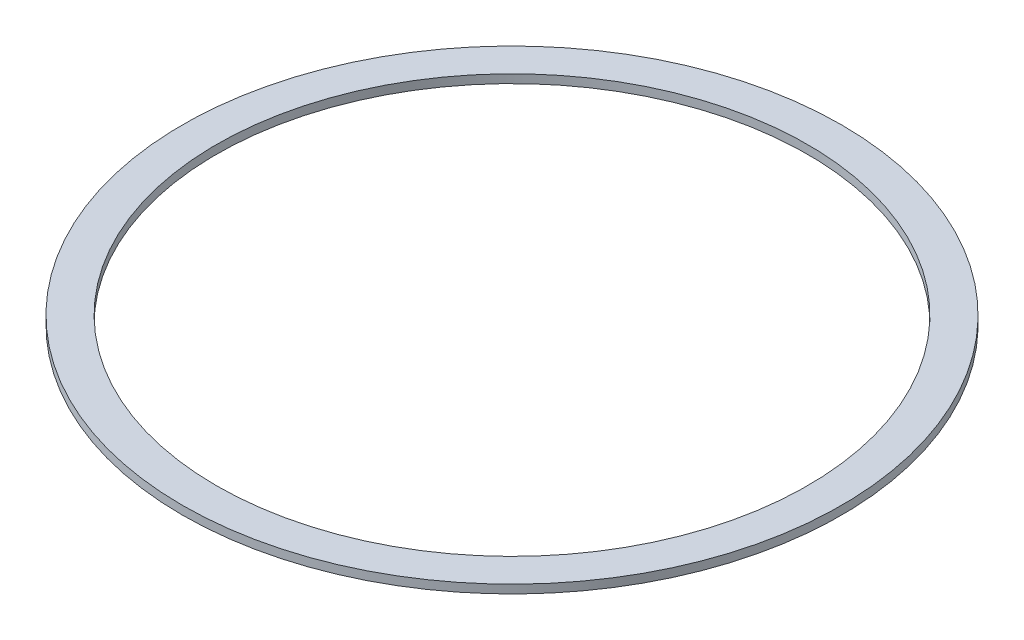
ISO-10303-21;
HEADER;
FILE_DESCRIPTION(('STEP AP214'),'2;1');
FILE_NAME('part.step','',(''),(''),'','','');
FILE_SCHEMA(('AUTOMOTIVE_DESIGN { 1 0 10303 214 1 1 1 1 }'));
ENDSEC;
DATA;
#1=APPLICATION_CONTEXT('core data for automotive mechanical design processes');
#2=APPLICATION_PROTOCOL_DEFINITION('international standard','automotive_design',2000,#1);
#3=PRODUCT_CONTEXT('',#1,'mechanical');
#4=PRODUCT('Part','Part','',(#3));
#5=PRODUCT_RELATED_PRODUCT_CATEGORY('part','',(#4));
#6=PRODUCT_DEFINITION_FORMATION('','',#4);
#7=PRODUCT_DEFINITION_CONTEXT('part definition',#1,'design');
#8=PRODUCT_DEFINITION('design','',#6,#7);
#9=PRODUCT_DEFINITION_SHAPE('','',#8);
#10=(LENGTH_UNIT() NAMED_UNIT(*) SI_UNIT(.MILLI.,.METRE.));
#11=(NAMED_UNIT(*) PLANE_ANGLE_UNIT() SI_UNIT($,.RADIAN.));
#12=(NAMED_UNIT(*) SI_UNIT($,.STERADIAN.) SOLID_ANGLE_UNIT());
#13=UNCERTAINTY_MEASURE_WITH_UNIT(LENGTH_MEASURE(1.E-05),#10,'distance_accuracy_value','');
#14=(GEOMETRIC_REPRESENTATION_CONTEXT(3) GLOBAL_UNCERTAINTY_ASSIGNED_CONTEXT((#13)) GLOBAL_UNIT_ASSIGNED_CONTEXT((#10,
#11,#12)) REPRESENTATION_CONTEXT('',''));
#15=CARTESIAN_POINT('',(0.,0.,0.));
#16=DIRECTION('',(0.,0.,1.));
#17=DIRECTION('',(1.,0.,0.));
#18=AXIS2_PLACEMENT_3D('',#15,#16,#17);
#19=CARTESIAN_POINT('',(0.,1.,0.));
#20=DIRECTION('',(0.,1.,0.));
#21=DIRECTION('',(0.,0.,1.));
#22=AXIS2_PLACEMENT_3D('',#19,#20,#21);
#23=PLANE('',#22);
#24=CARTESIAN_POINT('',(0.,1.,0.));
#25=DIRECTION('',(0.,1.,0.));
#26=DIRECTION('',(0.,0.,1.));
#27=AXIS2_PLACEMENT_3D('',#24,#25,#26);
#28=CIRCLE('',#27,38.75);
#29=CARTESIAN_POINT('',(0.,1.,38.75));
#30=VERTEX_POINT('',#29);
#31=EDGE_CURVE('E10',#30,#30,#28,.T.);
#32=ORIENTED_EDGE('',*,*,#31,.T.);
#33=EDGE_LOOP('',(#32));
#34=FACE_BOUND('',#33,.T.);
#35=CARTESIAN_POINT('',(0.,1.,0.));
#36=DIRECTION('',(0.,1.,0.));
#37=DIRECTION('',(0.,0.,1.));
#38=AXIS2_PLACEMENT_3D('',#35,#36,#37);
#39=CIRCLE('',#38,34.75);
#40=CARTESIAN_POINT('',(0.,1.,34.75));
#41=VERTEX_POINT('',#40);
#42=EDGE_CURVE('E46',#41,#41,#39,.T.);
#43=ORIENTED_EDGE('',*,*,#42,.F.);
#44=EDGE_LOOP('',(#43));
#45=FACE_BOUND('',#44,.T.);
#46=ADVANCED_FACE('F35',(#34,#45),#23,.T.);
#47=CARTESIAN_POINT('',(0.,0.,0.));
#48=DIRECTION('',(0.,1.,0.));
#49=DIRECTION('',(0.,0.,1.));
#50=AXIS2_PLACEMENT_3D('',#47,#48,#49);
#51=PLANE('',#50);
#52=CARTESIAN_POINT('',(0.,0.,0.));
#53=DIRECTION('',(0.,1.,0.));
#54=DIRECTION('',(0.,0.,1.));
#55=AXIS2_PLACEMENT_3D('',#52,#53,#54);
#56=CIRCLE('',#55,38.75);
#57=CARTESIAN_POINT('',(0.,0.,38.75));
#58=VERTEX_POINT('',#57);
#59=EDGE_CURVE('E39',#58,#58,#56,.T.);
#60=ORIENTED_EDGE('',*,*,#59,.F.);
#61=EDGE_LOOP('',(#60));
#62=FACE_BOUND('',#61,.T.);
#63=CARTESIAN_POINT('',(0.,0.,0.));
#64=DIRECTION('',(0.,1.,0.));
#65=DIRECTION('',(0.,0.,1.));
#66=AXIS2_PLACEMENT_3D('',#63,#64,#65);
#67=CIRCLE('',#66,34.75);
#68=CARTESIAN_POINT('',(0.,0.,34.75));
#69=VERTEX_POINT('',#68);
#70=EDGE_CURVE('E48',#69,#69,#67,.T.);
#71=ORIENTED_EDGE('',*,*,#70,.T.);
#72=EDGE_LOOP('',(#71));
#73=FACE_BOUND('',#72,.T.);
#74=ADVANCED_FACE('F58',(#62,#73),#51,.F.);
#75=CARTESIAN_POINT('',(0.,1.,0.));
#76=DIRECTION('',(0.,-1.,0.));
#77=DIRECTION('',(0.,0.,-1.));
#78=AXIS2_PLACEMENT_3D('',#75,#76,#77);
#79=CYLINDRICAL_SURFACE('',#78,38.75);
#80=ORIENTED_EDGE('',*,*,#31,.F.);
#81=EDGE_LOOP('',(#80));
#82=FACE_BOUND('',#81,.T.);
#83=ORIENTED_EDGE('',*,*,#59,.T.);
#84=EDGE_LOOP('',(#83));
#85=FACE_BOUND('',#84,.T.);
#86=ADVANCED_FACE('F37',(#82,#85),#79,.T.);
#87=CARTESIAN_POINT('',(0.,1.,0.));
#88=DIRECTION('',(0.,-1.,0.));
#89=DIRECTION('',(0.,0.,-1.));
#90=AXIS2_PLACEMENT_3D('',#87,#88,#89);
#91=CYLINDRICAL_SURFACE('',#90,34.75);
#92=ORIENTED_EDGE('',*,*,#42,.T.);
#93=EDGE_LOOP('',(#92));
#94=FACE_BOUND('',#93,.T.);
#95=ORIENTED_EDGE('',*,*,#70,.F.);
#96=EDGE_LOOP('',(#95));
#97=FACE_BOUND('',#96,.T.);
#98=ADVANCED_FACE('F54',(#94,#97),#91,.F.);
#99=CLOSED_SHELL('',(#46,#74,#86,#98));
#100=MANIFOLD_SOLID_BREP('B2',#99);
#101=ADVANCED_BREP_SHAPE_REPRESENTATION('',(#18,#100),#14);
#102=SHAPE_DEFINITION_REPRESENTATION(#9,#101);
ENDSEC;
END-ISO-10303-21;
